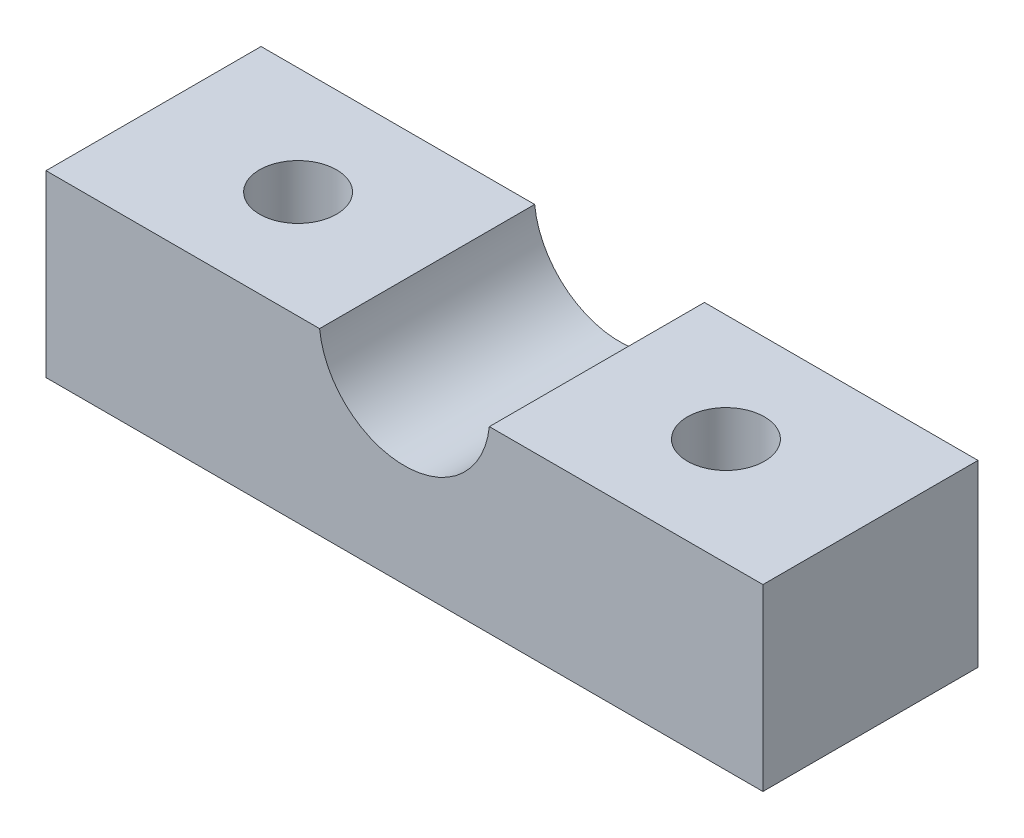
ISO-10303-21;
HEADER;
FILE_DESCRIPTION(('STEP AP214'),'2;1');
FILE_NAME('part.step','',(''),(''),'','','');
FILE_SCHEMA(('AUTOMOTIVE_DESIGN { 1 0 10303 214 1 1 1 1 }'));
ENDSEC;
DATA;
#1=APPLICATION_CONTEXT('core data for automotive mechanical design processes');
#2=APPLICATION_PROTOCOL_DEFINITION('international standard','automotive_design',2000,#1);
#3=PRODUCT_CONTEXT('',#1,'mechanical');
#4=PRODUCT('Part','Part','',(#3));
#5=PRODUCT_RELATED_PRODUCT_CATEGORY('part','',(#4));
#6=PRODUCT_DEFINITION_FORMATION('','',#4);
#7=PRODUCT_DEFINITION_CONTEXT('part definition',#1,'design');
#8=PRODUCT_DEFINITION('design','',#6,#7);
#9=PRODUCT_DEFINITION_SHAPE('','',#8);
#10=(LENGTH_UNIT() NAMED_UNIT(*) SI_UNIT(.MILLI.,.METRE.));
#11=(NAMED_UNIT(*) PLANE_ANGLE_UNIT() SI_UNIT($,.RADIAN.));
#12=(NAMED_UNIT(*) SI_UNIT($,.STERADIAN.) SOLID_ANGLE_UNIT());
#13=UNCERTAINTY_MEASURE_WITH_UNIT(LENGTH_MEASURE(1.E-05),#10,'distance_accuracy_value','');
#14=(GEOMETRIC_REPRESENTATION_CONTEXT(3) GLOBAL_UNCERTAINTY_ASSIGNED_CONTEXT((#13)) GLOBAL_UNIT_ASSIGNED_CONTEXT((#10,
#11,#12)) REPRESENTATION_CONTEXT('',''));
#15=CARTESIAN_POINT('',(0.,0.,0.));
#16=DIRECTION('',(0.,0.,1.));
#17=DIRECTION('',(1.,0.,0.));
#18=AXIS2_PLACEMENT_3D('',#15,#16,#17);
#19=CARTESIAN_POINT('',(20.,0.,6.));
#20=DIRECTION('',(-1.,0.,0.));
#21=DIRECTION('',(0.,0.,1.));
#22=AXIS2_PLACEMENT_3D('',#19,#20,#21);
#23=PLANE('',#22);
#24=DIRECTION('',(0.,1.,0.));
#25=VECTOR('',#24,1.);
#26=CARTESIAN_POINT('',(20.,0.,-6.));
#27=LINE('',#26,#25);
#28=CARTESIAN_POINT('',(20.,0.,-6.));
#29=VERTEX_POINT('',#28);
#30=CARTESIAN_POINT('',(20.,9.99999999999999,-6.));
#31=VERTEX_POINT('',#30);
#32=EDGE_CURVE('E117',#29,#31,#27,.T.);
#33=ORIENTED_EDGE('',*,*,#32,.T.);
#34=DIRECTION('',(0.,0.,-1.));
#35=VECTOR('',#34,1.);
#36=CARTESIAN_POINT('',(20.,9.99999999999999,6.));
#37=LINE('',#36,#35);
#38=CARTESIAN_POINT('',(20.,9.99999999999999,6.));
#39=VERTEX_POINT('',#38);
#40=EDGE_CURVE('E11',#39,#31,#37,.T.);
#41=ORIENTED_EDGE('',*,*,#40,.F.);
#42=DIRECTION('',(0.,1.,0.));
#43=VECTOR('',#42,1.);
#44=CARTESIAN_POINT('',(20.,0.,6.));
#45=LINE('',#44,#43);
#46=CARTESIAN_POINT('',(20.,0.,6.));
#47=VERTEX_POINT('',#46);
#48=EDGE_CURVE('E128',#47,#39,#45,.T.);
#49=ORIENTED_EDGE('',*,*,#48,.F.);
#50=DIRECTION('',(0.,0.,-1.));
#51=VECTOR('',#50,1.);
#52=CARTESIAN_POINT('',(20.,0.,6.));
#53=LINE('',#52,#51);
#54=EDGE_CURVE('E113',#47,#29,#53,.T.);
#55=ORIENTED_EDGE('',*,*,#54,.T.);
#56=EDGE_LOOP('',(#33,#41,#49,#55));
#57=FACE_BOUND('',#56,.T.);
#58=ADVANCED_FACE('F33',(#57),#23,.F.);
#59=CARTESIAN_POINT('',(20.,9.99999999999999,6.));
#60=DIRECTION('',(0.,-1.,0.));
#61=DIRECTION('',(1.,0.,0.));
#62=AXIS2_PLACEMENT_3D('',#59,#60,#61);
#63=PLANE('',#62);
#64=CARTESIAN_POINT('',(11.9365,10.,0.));
#65=DIRECTION('',(0.,-1.,0.));
#66=DIRECTION('',(0.,0.,-1.));
#67=AXIS2_PLACEMENT_3D('',#64,#65,#66);
#68=CIRCLE('',#67,2.15);
#69=CARTESIAN_POINT('',(11.9365,10.,-2.15));
#70=VERTEX_POINT('',#69);
#71=EDGE_CURVE('E121',#70,#70,#68,.T.);
#72=ORIENTED_EDGE('',*,*,#71,.T.);
#73=EDGE_LOOP('',(#72));
#74=FACE_BOUND('',#73,.T.);
#75=DIRECTION('',(-1.,0.,0.));
#76=VECTOR('',#75,1.);
#77=CARTESIAN_POINT('',(20.,9.99999999999999,-6.));
#78=LINE('',#77,#76);
#79=CARTESIAN_POINT('',(4.73618055504644,9.99999999999999,-6.));
#80=VERTEX_POINT('',#79);
#81=EDGE_CURVE('E120',#31,#80,#78,.T.);
#82=ORIENTED_EDGE('',*,*,#81,.T.);
#83=DIRECTION('',(0.,0.,-1.));
#84=VECTOR('',#83,1.);
#85=CARTESIAN_POINT('',(4.73618055504644,9.99999999999999,6.));
#86=LINE('',#85,#84);
#87=CARTESIAN_POINT('',(4.73618055504644,9.99999999999999,6.));
#88=VERTEX_POINT('',#87);
#89=EDGE_CURVE('E41',#88,#80,#86,.T.);
#90=ORIENTED_EDGE('',*,*,#89,.F.);
#91=DIRECTION('',(-1.,0.,0.));
#92=VECTOR('',#91,1.);
#93=CARTESIAN_POINT('',(20.,9.99999999999999,6.));
#94=LINE('',#93,#92);
#95=EDGE_CURVE('E86',#39,#88,#94,.T.);
#96=ORIENTED_EDGE('',*,*,#95,.F.);
#97=ORIENTED_EDGE('',*,*,#40,.T.);
#98=EDGE_LOOP('',(#82,#90,#96,#97));
#99=FACE_BOUND('',#98,.T.);
#100=ADVANCED_FACE('F155',(#74,#99),#63,.F.);
#101=CARTESIAN_POINT('',(0.,10.5,6.));
#102=DIRECTION('',(0.,0.,-1.));
#103=DIRECTION('',(-1.,0.,0.));
#104=AXIS2_PLACEMENT_3D('',#101,#102,#103);
#105=CYLINDRICAL_SURFACE('',#104,4.7625);
#106=CARTESIAN_POINT('',(0.,10.5,-6.));
#107=DIRECTION('',(0.,0.,-1.));
#108=DIRECTION('',(1.,0.,0.));
#109=AXIS2_PLACEMENT_3D('',#106,#107,#108);
#110=CIRCLE('',#109,4.7625);
#111=CARTESIAN_POINT('',(-4.73618055504644,10.,-6.));
#112=VERTEX_POINT('',#111);
#113=EDGE_CURVE('E123',#80,#112,#110,.T.);
#114=ORIENTED_EDGE('',*,*,#113,.T.);
#115=DIRECTION('',(0.,0.,-1.));
#116=VECTOR('',#115,1.);
#117=CARTESIAN_POINT('',(-4.73618055504644,10.,6.));
#118=LINE('',#117,#116);
#119=CARTESIAN_POINT('',(-4.73618055504644,10.,6.));
#120=VERTEX_POINT('',#119);
#121=EDGE_CURVE('E108',#120,#112,#118,.T.);
#122=ORIENTED_EDGE('',*,*,#121,.F.);
#123=CARTESIAN_POINT('',(0.,10.5,6.));
#124=DIRECTION('',(0.,0.,-1.));
#125=DIRECTION('',(1.,0.,0.));
#126=AXIS2_PLACEMENT_3D('',#123,#124,#125);
#127=CIRCLE('',#126,4.7625);
#128=EDGE_CURVE('E99',#88,#120,#127,.T.);
#129=ORIENTED_EDGE('',*,*,#128,.F.);
#130=ORIENTED_EDGE('',*,*,#89,.T.);
#131=EDGE_LOOP('',(#114,#122,#129,#130));
#132=FACE_BOUND('',#131,.T.);
#133=ADVANCED_FACE('F134',(#132),#105,.F.);
#134=CARTESIAN_POINT('',(-4.73618055504644,10.,6.));
#135=DIRECTION('',(0.,-1.,0.));
#136=DIRECTION('',(1.,0.,0.));
#137=AXIS2_PLACEMENT_3D('',#134,#135,#136);
#138=PLANE('',#137);
#139=CARTESIAN_POINT('',(-11.9365,10.,0.));
#140=DIRECTION('',(0.,-1.,0.));
#141=DIRECTION('',(0.,0.,-1.));
#142=AXIS2_PLACEMENT_3D('',#139,#140,#141);
#143=CIRCLE('',#142,2.15);
#144=CARTESIAN_POINT('',(-11.9365,10.,-2.15));
#145=VERTEX_POINT('',#144);
#146=EDGE_CURVE('E172',#145,#145,#143,.T.);
#147=ORIENTED_EDGE('',*,*,#146,.T.);
#148=EDGE_LOOP('',(#147));
#149=FACE_BOUND('',#148,.T.);
#150=DIRECTION('',(-1.,0.,0.));
#151=VECTOR('',#150,1.);
#152=CARTESIAN_POINT('',(-4.73618055504644,10.,-6.));
#153=LINE('',#152,#151);
#154=CARTESIAN_POINT('',(-20.,9.99999999999999,-6.));
#155=VERTEX_POINT('',#154);
#156=EDGE_CURVE('E107',#112,#155,#153,.T.);
#157=ORIENTED_EDGE('',*,*,#156,.T.);
#158=DIRECTION('',(0.,0.,-1.));
#159=VECTOR('',#158,1.);
#160=CARTESIAN_POINT('',(-20.,9.99999999999999,6.));
#161=LINE('',#160,#159);
#162=CARTESIAN_POINT('',(-20.,9.99999999999999,6.));
#163=VERTEX_POINT('',#162);
#164=EDGE_CURVE('E104',#163,#155,#161,.T.);
#165=ORIENTED_EDGE('',*,*,#164,.F.);
#166=DIRECTION('',(-1.,0.,0.));
#167=VECTOR('',#166,1.);
#168=CARTESIAN_POINT('',(-4.73618055504644,10.,6.));
#169=LINE('',#168,#167);
#170=EDGE_CURVE('E93',#120,#163,#169,.T.);
#171=ORIENTED_EDGE('',*,*,#170,.F.);
#172=ORIENTED_EDGE('',*,*,#121,.T.);
#173=EDGE_LOOP('',(#157,#165,#171,#172));
#174=FACE_BOUND('',#173,.T.);
#175=ADVANCED_FACE('F105',(#149,#174),#138,.F.);
#176=CARTESIAN_POINT('',(-20.,0.,6.));
#177=DIRECTION('',(1.,0.,0.));
#178=DIRECTION('',(0.,0.,-1.));
#179=AXIS2_PLACEMENT_3D('',#176,#177,#178);
#180=PLANE('',#179);
#181=DIRECTION('',(0.,-1.,0.));
#182=VECTOR('',#181,1.);
#183=CARTESIAN_POINT('',(-20.,0.,-6.));
#184=LINE('',#183,#182);
#185=CARTESIAN_POINT('',(-20.,0.,-6.));
#186=VERTEX_POINT('',#185);
#187=EDGE_CURVE('E72',#155,#186,#184,.T.);
#188=ORIENTED_EDGE('',*,*,#187,.T.);
#189=DIRECTION('',(0.,0.,-1.));
#190=VECTOR('',#189,1.);
#191=CARTESIAN_POINT('',(-20.,0.,6.));
#192=LINE('',#191,#190);
#193=CARTESIAN_POINT('',(-20.,0.,6.));
#194=VERTEX_POINT('',#193);
#195=EDGE_CURVE('E109',#194,#186,#192,.T.);
#196=ORIENTED_EDGE('',*,*,#195,.F.);
#197=DIRECTION('',(0.,-1.,0.));
#198=VECTOR('',#197,1.);
#199=CARTESIAN_POINT('',(-20.,0.,6.));
#200=LINE('',#199,#198);
#201=EDGE_CURVE('E97',#163,#194,#200,.T.);
#202=ORIENTED_EDGE('',*,*,#201,.F.);
#203=ORIENTED_EDGE('',*,*,#164,.T.);
#204=EDGE_LOOP('',(#188,#196,#202,#203));
#205=FACE_BOUND('',#204,.T.);
#206=ADVANCED_FACE('F111',(#205),#180,.F.);
#207=CARTESIAN_POINT('',(20.,0.,6.));
#208=DIRECTION('',(0.,1.,0.));
#209=DIRECTION('',(0.,0.,1.));
#210=AXIS2_PLACEMENT_3D('',#207,#208,#209);
#211=PLANE('',#210);
#212=CARTESIAN_POINT('',(-11.9365,0.,0.));
#213=DIRECTION('',(0.,-1.,0.));
#214=DIRECTION('',(0.,0.,-1.));
#215=AXIS2_PLACEMENT_3D('',#212,#213,#214);
#216=CIRCLE('',#215,4.);
#217=CARTESIAN_POINT('',(-11.9365,0.,-4.));
#218=VERTEX_POINT('',#217);
#219=EDGE_CURVE('E267',#218,#218,#216,.T.);
#220=ORIENTED_EDGE('',*,*,#219,.F.);
#221=EDGE_LOOP('',(#220));
#222=FACE_BOUND('',#221,.T.);
#223=CARTESIAN_POINT('',(11.9365,0.,0.));
#224=DIRECTION('',(0.,-1.,0.));
#225=DIRECTION('',(0.,0.,-1.));
#226=AXIS2_PLACEMENT_3D('',#223,#224,#225);
#227=CIRCLE('',#226,4.);
#228=CARTESIAN_POINT('',(11.9365,0.,-4.));
#229=VERTEX_POINT('',#228);
#230=EDGE_CURVE('E174',#229,#229,#227,.T.);
#231=ORIENTED_EDGE('',*,*,#230,.F.);
#232=EDGE_LOOP('',(#231));
#233=FACE_BOUND('',#232,.T.);
#234=DIRECTION('',(1.,0.,0.));
#235=VECTOR('',#234,1.);
#236=CARTESIAN_POINT('',(20.,0.,-6.));
#237=LINE('',#236,#235);
#238=EDGE_CURVE('E78',#186,#29,#237,.T.);
#239=ORIENTED_EDGE('',*,*,#238,.T.);
#240=ORIENTED_EDGE('',*,*,#54,.F.);
#241=DIRECTION('',(1.,0.,0.));
#242=VECTOR('',#241,1.);
#243=CARTESIAN_POINT('',(20.,0.,6.));
#244=LINE('',#243,#242);
#245=EDGE_CURVE('E49',#194,#47,#244,.T.);
#246=ORIENTED_EDGE('',*,*,#245,.F.);
#247=ORIENTED_EDGE('',*,*,#195,.T.);
#248=EDGE_LOOP('',(#239,#240,#246,#247));
#249=FACE_BOUND('',#248,.T.);
#250=ADVANCED_FACE('F141',(#222,#233,#249),#211,.F.);
#251=CARTESIAN_POINT('',(0.,10.5,6.));
#252=DIRECTION('',(0.,0.,1.));
#253=DIRECTION('',(1.,0.,0.));
#254=AXIS2_PLACEMENT_3D('',#251,#252,#253);
#255=PLANE('',#254);
#256=ORIENTED_EDGE('',*,*,#48,.T.);
#257=ORIENTED_EDGE('',*,*,#95,.T.);
#258=ORIENTED_EDGE('',*,*,#128,.T.);
#259=ORIENTED_EDGE('',*,*,#170,.T.);
#260=ORIENTED_EDGE('',*,*,#201,.T.);
#261=ORIENTED_EDGE('',*,*,#245,.T.);
#262=EDGE_LOOP('',(#256,#257,#258,#259,#260,#261));
#263=FACE_BOUND('',#262,.T.);
#264=ADVANCED_FACE('F95',(#263),#255,.T.);
#265=CARTESIAN_POINT('',(0.,10.5,-6.));
#266=DIRECTION('',(0.,0.,1.));
#267=DIRECTION('',(1.,0.,0.));
#268=AXIS2_PLACEMENT_3D('',#265,#266,#267);
#269=PLANE('',#268);
#270=ORIENTED_EDGE('',*,*,#32,.F.);
#271=ORIENTED_EDGE('',*,*,#238,.F.);
#272=ORIENTED_EDGE('',*,*,#187,.F.);
#273=ORIENTED_EDGE('',*,*,#156,.F.);
#274=ORIENTED_EDGE('',*,*,#113,.F.);
#275=ORIENTED_EDGE('',*,*,#81,.F.);
#276=EDGE_LOOP('',(#270,#271,#272,#273,#274,#275));
#277=FACE_BOUND('',#276,.T.);
#278=ADVANCED_FACE('F137',(#277),#269,.F.);
#279=CARTESIAN_POINT('',(11.9365,0.,0.));
#280=DIRECTION('',(0.,-1.,0.));
#281=DIRECTION('',(0.,0.,-1.));
#282=AXIS2_PLACEMENT_3D('',#279,#280,#281);
#283=CYLINDRICAL_SURFACE('',#282,2.15);
#284=ORIENTED_EDGE('',*,*,#71,.F.);
#285=EDGE_LOOP('',(#284));
#286=FACE_BOUND('',#285,.T.);
#287=CARTESIAN_POINT('',(11.9365,4.,0.));
#288=DIRECTION('',(0.,-1.,0.));
#289=DIRECTION('',(0.,0.,-1.));
#290=AXIS2_PLACEMENT_3D('',#287,#288,#289);
#291=CIRCLE('',#290,2.15);
#292=CARTESIAN_POINT('',(11.9365,4.,-2.15));
#293=VERTEX_POINT('',#292);
#294=EDGE_CURVE('E187',#293,#293,#291,.T.);
#295=ORIENTED_EDGE('',*,*,#294,.T.);
#296=EDGE_LOOP('',(#295));
#297=FACE_BOUND('',#296,.T.);
#298=ADVANCED_FACE('F194',(#286,#297),#283,.F.);
#299=CARTESIAN_POINT('',(14.0865,4.,0.));
#300=DIRECTION('',(0.,1.,0.));
#301=DIRECTION('',(0.,0.,1.));
#302=AXIS2_PLACEMENT_3D('',#299,#300,#301);
#303=PLANE('',#302);
#304=ORIENTED_EDGE('',*,*,#294,.F.);
#305=EDGE_LOOP('',(#304));
#306=FACE_BOUND('',#305,.T.);
#307=CARTESIAN_POINT('',(11.9365,4.,0.));
#308=DIRECTION('',(0.,-1.,0.));
#309=DIRECTION('',(0.,0.,-1.));
#310=AXIS2_PLACEMENT_3D('',#307,#308,#309);
#311=CIRCLE('',#310,4.);
#312=CARTESIAN_POINT('',(11.9365,4.,-4.));
#313=VERTEX_POINT('',#312);
#314=EDGE_CURVE('E178',#313,#313,#311,.T.);
#315=ORIENTED_EDGE('',*,*,#314,.T.);
#316=EDGE_LOOP('',(#315));
#317=FACE_BOUND('',#316,.T.);
#318=ADVANCED_FACE('F197',(#306,#317),#303,.F.);
#319=CARTESIAN_POINT('',(11.9365,0.,0.));
#320=DIRECTION('',(0.,-1.,0.));
#321=DIRECTION('',(0.,0.,-1.));
#322=AXIS2_PLACEMENT_3D('',#319,#320,#321);
#323=CYLINDRICAL_SURFACE('',#322,4.);
#324=ORIENTED_EDGE('',*,*,#314,.F.);
#325=EDGE_LOOP('',(#324));
#326=FACE_BOUND('',#325,.T.);
#327=ORIENTED_EDGE('',*,*,#230,.T.);
#328=EDGE_LOOP('',(#327));
#329=FACE_BOUND('',#328,.T.);
#330=ADVANCED_FACE('F203',(#326,#329),#323,.F.);
#331=CARTESIAN_POINT('',(-11.9365,0.,0.));
#332=DIRECTION('',(0.,-1.,0.));
#333=DIRECTION('',(0.,0.,-1.));
#334=AXIS2_PLACEMENT_3D('',#331,#332,#333);
#335=CYLINDRICAL_SURFACE('',#334,2.15);
#336=ORIENTED_EDGE('',*,*,#146,.F.);
#337=EDGE_LOOP('',(#336));
#338=FACE_BOUND('',#337,.T.);
#339=CARTESIAN_POINT('',(-11.9365,4.,0.));
#340=DIRECTION('',(0.,-1.,0.));
#341=DIRECTION('',(0.,0.,-1.));
#342=AXIS2_PLACEMENT_3D('',#339,#340,#341);
#343=CIRCLE('',#342,2.15);
#344=CARTESIAN_POINT('',(-11.9365,4.,-2.15));
#345=VERTEX_POINT('',#344);
#346=EDGE_CURVE('E175',#345,#345,#343,.T.);
#347=ORIENTED_EDGE('',*,*,#346,.T.);
#348=EDGE_LOOP('',(#347));
#349=FACE_BOUND('',#348,.T.);
#350=ADVANCED_FACE('F209',(#338,#349),#335,.F.);
#351=CARTESIAN_POINT('',(-9.7865,4.,0.));
#352=DIRECTION('',(0.,1.,0.));
#353=DIRECTION('',(0.,0.,1.));
#354=AXIS2_PLACEMENT_3D('',#351,#352,#353);
#355=PLANE('',#354);
#356=ORIENTED_EDGE('',*,*,#346,.F.);
#357=EDGE_LOOP('',(#356));
#358=FACE_BOUND('',#357,.T.);
#359=CARTESIAN_POINT('',(-11.9365,4.,0.));
#360=DIRECTION('',(0.,-1.,0.));
#361=DIRECTION('',(0.,0.,-1.));
#362=AXIS2_PLACEMENT_3D('',#359,#360,#361);
#363=CIRCLE('',#362,4.);
#364=CARTESIAN_POINT('',(-11.9365,4.,-4.));
#365=VERTEX_POINT('',#364);
#366=EDGE_CURVE('E181',#365,#365,#363,.T.);
#367=ORIENTED_EDGE('',*,*,#366,.T.);
#368=EDGE_LOOP('',(#367));
#369=FACE_BOUND('',#368,.T.);
#370=ADVANCED_FACE('F215',(#358,#369),#355,.F.);
#371=CARTESIAN_POINT('',(-11.9365,0.,0.));
#372=DIRECTION('',(0.,-1.,0.));
#373=DIRECTION('',(0.,0.,-1.));
#374=AXIS2_PLACEMENT_3D('',#371,#372,#373);
#375=CYLINDRICAL_SURFACE('',#374,4.);
#376=ORIENTED_EDGE('',*,*,#366,.F.);
#377=EDGE_LOOP('',(#376));
#378=FACE_BOUND('',#377,.T.);
#379=ORIENTED_EDGE('',*,*,#219,.T.);
#380=EDGE_LOOP('',(#379));
#381=FACE_BOUND('',#380,.T.);
#382=ADVANCED_FACE('F250',(#378,#381),#375,.F.);
#383=CLOSED_SHELL('',(#58,#100,#133,#175,#206,#250,#264,#278,#298,#318,#330,#350,#370,#382));
#384=MANIFOLD_SOLID_BREP('B2',#383);
#385=ADVANCED_BREP_SHAPE_REPRESENTATION('',(#18,#384),#14);
#386=SHAPE_DEFINITION_REPRESENTATION(#9,#385);
ENDSEC;
END-ISO-10303-21;
